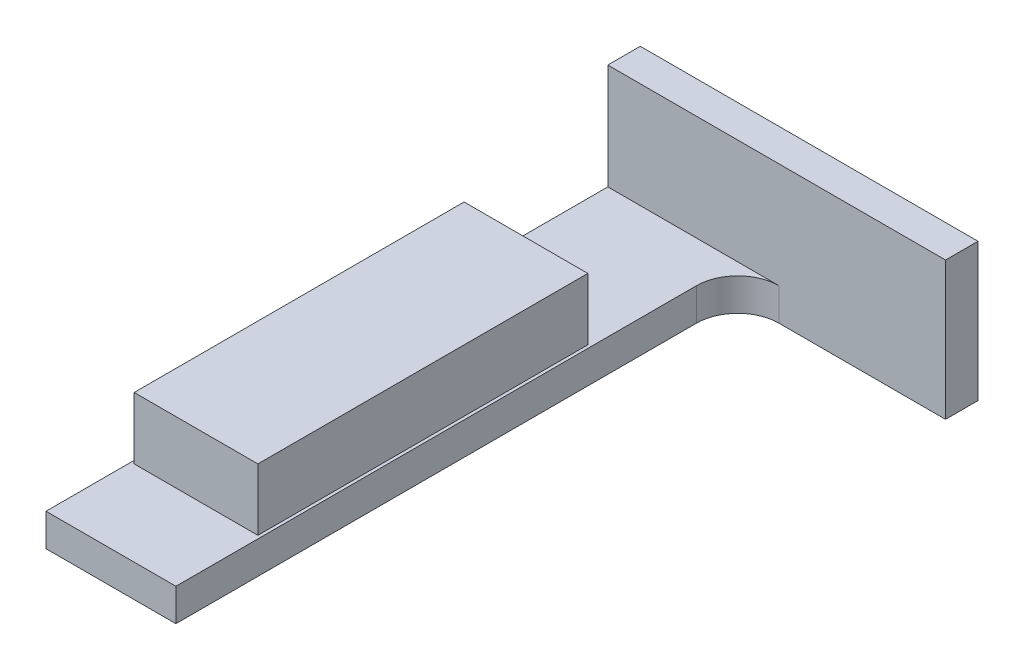
ISO-10303-21;
HEADER;
FILE_DESCRIPTION(('STEP AP214'),'2;1');
FILE_NAME('part.step','',(''),(''),'','','');
FILE_SCHEMA(('AUTOMOTIVE_DESIGN { 1 0 10303 214 1 1 1 1 }'));
ENDSEC;
DATA;
#1=APPLICATION_CONTEXT('core data for automotive mechanical design processes');
#2=APPLICATION_PROTOCOL_DEFINITION('international standard','automotive_design',2000,#1);
#3=PRODUCT_CONTEXT('',#1,'mechanical');
#4=PRODUCT('Part','Part','',(#3));
#5=PRODUCT_RELATED_PRODUCT_CATEGORY('part','',(#4));
#6=PRODUCT_DEFINITION_FORMATION('','',#4);
#7=PRODUCT_DEFINITION_CONTEXT('part definition',#1,'design');
#8=PRODUCT_DEFINITION('design','',#6,#7);
#9=PRODUCT_DEFINITION_SHAPE('','',#8);
#10=(LENGTH_UNIT() NAMED_UNIT(*) SI_UNIT(.MILLI.,.METRE.));
#11=(NAMED_UNIT(*) PLANE_ANGLE_UNIT() SI_UNIT($,.RADIAN.));
#12=(NAMED_UNIT(*) SI_UNIT($,.STERADIAN.) SOLID_ANGLE_UNIT());
#13=UNCERTAINTY_MEASURE_WITH_UNIT(LENGTH_MEASURE(1.E-05),#10,'distance_accuracy_value','');
#14=(GEOMETRIC_REPRESENTATION_CONTEXT(3) GLOBAL_UNCERTAINTY_ASSIGNED_CONTEXT((#13)) GLOBAL_UNIT_ASSIGNED_CONTEXT((#10,
#11,#12)) REPRESENTATION_CONTEXT('',''));
#15=CARTESIAN_POINT('',(0.,0.,0.));
#16=DIRECTION('',(0.,0.,1.));
#17=DIRECTION('',(1.,0.,0.));
#18=AXIS2_PLACEMENT_3D('',#15,#16,#17);
#19=CARTESIAN_POINT('',(0.,-16.25,91.5));
#20=DIRECTION('',(0.,-1.,0.));
#21=DIRECTION('',(0.,0.,-1.));
#22=AXIS2_PLACEMENT_3D('',#19,#20,#21);
#23=PLANE('',#22);
#24=DIRECTION('',(-1.,0.,0.));
#25=VECTOR('',#24,1.);
#26=CARTESIAN_POINT('',(0.,-16.25,5.));
#27=LINE('',#26,#25);
#28=CARTESIAN_POINT('',(26.35,-16.25,5.));
#29=VERTEX_POINT('',#28);
#30=CARTESIAN_POINT('',(0.,-16.25,5.));
#31=VERTEX_POINT('',#30);
#32=EDGE_CURVE('E143',#29,#31,#27,.T.);
#33=ORIENTED_EDGE('',*,*,#32,.T.);
#34=DIRECTION('',(0.,0.,-1.));
#35=VECTOR('',#34,1.);
#36=CARTESIAN_POINT('',(0.,-16.25,91.5));
#37=LINE('',#36,#35);
#38=CARTESIAN_POINT('',(0.,-16.25,91.5));
#39=VERTEX_POINT('',#38);
#40=EDGE_CURVE('E160',#39,#31,#37,.T.);
#41=ORIENTED_EDGE('',*,*,#40,.F.);
#42=DIRECTION('',(-1.,0.,0.));
#43=VECTOR('',#42,1.);
#44=CARTESIAN_POINT('',(0.,-16.25,91.5));
#45=LINE('',#44,#43);
#46=CARTESIAN_POINT('',(20.,-16.25,91.5));
#47=VERTEX_POINT('',#46);
#48=EDGE_CURVE('E158',#47,#39,#45,.T.);
#49=ORIENTED_EDGE('',*,*,#48,.F.);
#50=DIRECTION('',(0.,0.,-1.));
#51=VECTOR('',#50,1.);
#52=CARTESIAN_POINT('',(20.,-16.25,91.5));
#53=LINE('',#52,#51);
#54=CARTESIAN_POINT('',(20.,-16.25,11.35));
#55=VERTEX_POINT('',#54);
#56=EDGE_CURVE('E163',#47,#55,#53,.T.);
#57=ORIENTED_EDGE('',*,*,#56,.T.);
#58=CARTESIAN_POINT('',(26.35,-16.25,11.35));
#59=DIRECTION('',(0.,-1.,0.));
#60=DIRECTION('',(0.,0.,-1.));
#61=AXIS2_PLACEMENT_3D('',#58,#59,#60);
#62=CIRCLE('',#61,6.35);
#63=EDGE_CURVE('E42',#55,#29,#62,.T.);
#64=ORIENTED_EDGE('',*,*,#63,.T.);
#65=EDGE_LOOP('',(#33,#41,#49,#57,#64));
#66=FACE_BOUND('',#65,.T.);
#67=DIRECTION('',(0.,0.,1.));
#68=VECTOR('',#67,1.);
#69=CARTESIAN_POINT('',(0.474999999999993,-16.25,27.6));
#70=LINE('',#69,#68);
#71=CARTESIAN_POINT('',(0.474999999999993,-16.25,27.6));
#72=VERTEX_POINT('',#71);
#73=CARTESIAN_POINT('',(0.475,-16.25,78.4));
#74=VERTEX_POINT('',#73);
#75=EDGE_CURVE('E142',#72,#74,#70,.T.);
#76=ORIENTED_EDGE('',*,*,#75,.F.);
#77=DIRECTION('',(-1.,0.,0.));
#78=VECTOR('',#77,1.);
#79=CARTESIAN_POINT('',(0.474999999999993,-16.25,27.6));
#80=LINE('',#79,#78);
#81=CARTESIAN_POINT('',(19.525,-16.25,27.6));
#82=VERTEX_POINT('',#81);
#83=EDGE_CURVE('E139',#82,#72,#80,.T.);
#84=ORIENTED_EDGE('',*,*,#83,.F.);
#85=DIRECTION('',(0.,0.,-1.));
#86=VECTOR('',#85,1.);
#87=CARTESIAN_POINT('',(19.525,-16.25,27.6));
#88=LINE('',#87,#86);
#89=CARTESIAN_POINT('',(19.525,-16.25,78.4));
#90=VERTEX_POINT('',#89);
#91=EDGE_CURVE('E54',#90,#82,#88,.T.);
#92=ORIENTED_EDGE('',*,*,#91,.F.);
#93=DIRECTION('',(1.,0.,0.));
#94=VECTOR('',#93,1.);
#95=CARTESIAN_POINT('',(0.475,-16.25,78.4));
#96=LINE('',#95,#94);
#97=EDGE_CURVE('E49',#74,#90,#96,.T.);
#98=ORIENTED_EDGE('',*,*,#97,.F.);
#99=EDGE_LOOP('',(#76,#84,#92,#98));
#100=FACE_BOUND('',#99,.T.);
#101=ADVANCED_FACE('F34',(#66,#100),#23,.F.);
#102=CARTESIAN_POINT('',(0.,0.,5.));
#103=DIRECTION('',(1.,0.,0.));
#104=DIRECTION('',(0.,1.,0.));
#105=AXIS2_PLACEMENT_3D('',#102,#103,#104);
#106=PLANE('',#105);
#107=DIRECTION('',(0.,-1.,0.));
#108=VECTOR('',#107,1.);
#109=CARTESIAN_POINT('',(0.,0.,0.));
#110=LINE('',#109,#108);
#111=CARTESIAN_POINT('',(0.,0.,0.));
#112=VERTEX_POINT('',#111);
#113=CARTESIAN_POINT('',(0.,-21.25,0.));
#114=VERTEX_POINT('',#113);
#115=EDGE_CURVE('E190',#112,#114,#110,.T.);
#116=ORIENTED_EDGE('',*,*,#115,.T.);
#117=DIRECTION('',(0.,0.,-1.));
#118=VECTOR('',#117,1.);
#119=CARTESIAN_POINT('',(0.,-21.25,5.));
#120=LINE('',#119,#118);
#121=CARTESIAN_POINT('',(0.,-21.25,91.5));
#122=VERTEX_POINT('',#121);
#123=EDGE_CURVE('E177',#122,#114,#120,.T.);
#124=ORIENTED_EDGE('',*,*,#123,.F.);
#125=DIRECTION('',(0.,-1.,0.));
#126=VECTOR('',#125,1.);
#127=CARTESIAN_POINT('',(0.,-21.25,91.5));
#128=LINE('',#127,#126);
#129=EDGE_CURVE('E146',#39,#122,#128,.T.);
#130=ORIENTED_EDGE('',*,*,#129,.F.);
#131=ORIENTED_EDGE('',*,*,#40,.T.);
#132=DIRECTION('',(0.,-1.,0.));
#133=VECTOR('',#132,1.);
#134=CARTESIAN_POINT('',(0.,0.,5.));
#135=LINE('',#134,#133);
#136=CARTESIAN_POINT('',(0.,0.,5.));
#137=VERTEX_POINT('',#136);
#138=EDGE_CURVE('E182',#137,#31,#135,.T.);
#139=ORIENTED_EDGE('',*,*,#138,.F.);
#140=DIRECTION('',(0.,0.,-1.));
#141=VECTOR('',#140,1.);
#142=CARTESIAN_POINT('',(0.,0.,5.));
#143=LINE('',#142,#141);
#144=EDGE_CURVE('E189',#137,#112,#143,.T.);
#145=ORIENTED_EDGE('',*,*,#144,.T.);
#146=EDGE_LOOP('',(#116,#124,#130,#131,#139,#145));
#147=FACE_BOUND('',#146,.T.);
#148=ADVANCED_FACE('F244',(#147),#106,.F.);
#149=CARTESIAN_POINT('',(0.,-21.25,5.));
#150=DIRECTION('',(0.,1.,0.));
#151=DIRECTION('',(0.,0.,1.));
#152=AXIS2_PLACEMENT_3D('',#149,#150,#151);
#153=PLANE('',#152);
#154=DIRECTION('',(1.,0.,0.));
#155=VECTOR('',#154,1.);
#156=CARTESIAN_POINT('',(0.,-21.25,0.));
#157=LINE('',#156,#155);
#158=CARTESIAN_POINT('',(52.,-21.25,0.));
#159=VERTEX_POINT('',#158);
#160=EDGE_CURVE('E193',#114,#159,#157,.T.);
#161=ORIENTED_EDGE('',*,*,#160,.T.);
#162=DIRECTION('',(0.,0.,-1.));
#163=VECTOR('',#162,1.);
#164=CARTESIAN_POINT('',(52.,-21.25,5.));
#165=LINE('',#164,#163);
#166=CARTESIAN_POINT('',(52.,-21.25,5.));
#167=VERTEX_POINT('',#166);
#168=EDGE_CURVE('E205',#167,#159,#165,.T.);
#169=ORIENTED_EDGE('',*,*,#168,.F.);
#170=DIRECTION('',(1.,0.,0.));
#171=VECTOR('',#170,1.);
#172=CARTESIAN_POINT('',(0.,-21.25,5.));
#173=LINE('',#172,#171);
#174=CARTESIAN_POINT('',(26.35,-21.25,5.));
#175=VERTEX_POINT('',#174);
#176=EDGE_CURVE('E178',#175,#167,#173,.T.);
#177=ORIENTED_EDGE('',*,*,#176,.F.);
#178=CARTESIAN_POINT('',(26.35,-21.25,11.35));
#179=DIRECTION('',(0.,1.,0.));
#180=DIRECTION('',(0.,0.,1.));
#181=AXIS2_PLACEMENT_3D('',#178,#179,#180);
#182=CIRCLE('',#181,6.35);
#183=CARTESIAN_POINT('',(20.,-21.25,11.35));
#184=VERTEX_POINT('',#183);
#185=EDGE_CURVE('E11',#175,#184,#182,.T.);
#186=ORIENTED_EDGE('',*,*,#185,.T.);
#187=DIRECTION('',(0.,0.,-1.));
#188=VECTOR('',#187,1.);
#189=CARTESIAN_POINT('',(20.,-21.25,91.5));
#190=LINE('',#189,#188);
#191=CARTESIAN_POINT('',(20.,-21.25,91.5));
#192=VERTEX_POINT('',#191);
#193=EDGE_CURVE('E194',#192,#184,#190,.T.);
#194=ORIENTED_EDGE('',*,*,#193,.F.);
#195=DIRECTION('',(1.,0.,0.));
#196=VECTOR('',#195,1.);
#197=CARTESIAN_POINT('',(0.,-21.25,91.5));
#198=LINE('',#197,#196);
#199=EDGE_CURVE('E154',#122,#192,#198,.T.);
#200=ORIENTED_EDGE('',*,*,#199,.F.);
#201=ORIENTED_EDGE('',*,*,#123,.T.);
#202=EDGE_LOOP('',(#161,#169,#177,#186,#194,#200,#201));
#203=FACE_BOUND('',#202,.T.);
#204=ADVANCED_FACE('F230',(#203),#153,.F.);
#205=CARTESIAN_POINT('',(52.,0.,5.));
#206=DIRECTION('',(-1.,0.,0.));
#207=DIRECTION('',(0.,0.,1.));
#208=AXIS2_PLACEMENT_3D('',#205,#206,#207);
#209=PLANE('',#208);
#210=DIRECTION('',(0.,1.,0.));
#211=VECTOR('',#210,1.);
#212=CARTESIAN_POINT('',(52.,0.,0.));
#213=LINE('',#212,#211);
#214=CARTESIAN_POINT('',(52.,0.,0.));
#215=VERTEX_POINT('',#214);
#216=EDGE_CURVE('E196',#159,#215,#213,.T.);
#217=ORIENTED_EDGE('',*,*,#216,.T.);
#218=DIRECTION('',(0.,0.,-1.));
#219=VECTOR('',#218,1.);
#220=CARTESIAN_POINT('',(52.,0.,5.));
#221=LINE('',#220,#219);
#222=CARTESIAN_POINT('',(52.,0.,5.));
#223=VERTEX_POINT('',#222);
#224=EDGE_CURVE('E202',#223,#215,#221,.T.);
#225=ORIENTED_EDGE('',*,*,#224,.F.);
#226=DIRECTION('',(0.,1.,0.));
#227=VECTOR('',#226,1.);
#228=CARTESIAN_POINT('',(52.,0.,5.));
#229=LINE('',#228,#227);
#230=EDGE_CURVE('E181',#167,#223,#229,.T.);
#231=ORIENTED_EDGE('',*,*,#230,.F.);
#232=ORIENTED_EDGE('',*,*,#168,.T.);
#233=EDGE_LOOP('',(#217,#225,#231,#232));
#234=FACE_BOUND('',#233,.T.);
#235=ADVANCED_FACE('F235',(#234),#209,.F.);
#236=CARTESIAN_POINT('',(0.,0.,5.));
#237=DIRECTION('',(0.,-1.,0.));
#238=DIRECTION('',(0.,0.,-1.));
#239=AXIS2_PLACEMENT_3D('',#236,#237,#238);
#240=PLANE('',#239);
#241=DIRECTION('',(-1.,0.,0.));
#242=VECTOR('',#241,1.);
#243=CARTESIAN_POINT('',(0.,0.,0.));
#244=LINE('',#243,#242);
#245=EDGE_CURVE('E198',#215,#112,#244,.T.);
#246=ORIENTED_EDGE('',*,*,#245,.T.);
#247=ORIENTED_EDGE('',*,*,#144,.F.);
#248=DIRECTION('',(-1.,0.,0.));
#249=VECTOR('',#248,1.);
#250=CARTESIAN_POINT('',(0.,0.,5.));
#251=LINE('',#250,#249);
#252=EDGE_CURVE('E187',#223,#137,#251,.T.);
#253=ORIENTED_EDGE('',*,*,#252,.F.);
#254=ORIENTED_EDGE('',*,*,#224,.T.);
#255=EDGE_LOOP('',(#246,#247,#253,#254));
#256=FACE_BOUND('',#255,.T.);
#257=ADVANCED_FACE('F240',(#256),#240,.F.);
#258=CARTESIAN_POINT('',(0.,-21.25,5.));
#259=DIRECTION('',(0.,0.,1.));
#260=DIRECTION('',(1.,0.,0.));
#261=AXIS2_PLACEMENT_3D('',#258,#259,#260);
#262=PLANE('',#261);
#263=ORIENTED_EDGE('',*,*,#32,.F.);
#264=DIRECTION('',(0.,1.,0.));
#265=VECTOR('',#264,1.);
#266=CARTESIAN_POINT('',(26.35,-21.25,5.));
#267=LINE('',#266,#265);
#268=EDGE_CURVE('E176',#29,#175,#267,.F.);
#269=ORIENTED_EDGE('',*,*,#268,.T.);
#270=ORIENTED_EDGE('',*,*,#176,.T.);
#271=ORIENTED_EDGE('',*,*,#230,.T.);
#272=ORIENTED_EDGE('',*,*,#252,.T.);
#273=ORIENTED_EDGE('',*,*,#138,.T.);
#274=EDGE_LOOP('',(#263,#269,#270,#271,#272,#273));
#275=FACE_BOUND('',#274,.T.);
#276=ADVANCED_FACE('F227',(#275),#262,.T.);
#277=CARTESIAN_POINT('',(0.,-21.25,0.));
#278=DIRECTION('',(0.,0.,1.));
#279=DIRECTION('',(1.,0.,0.));
#280=AXIS2_PLACEMENT_3D('',#277,#278,#279);
#281=PLANE('',#280);
#282=ORIENTED_EDGE('',*,*,#115,.F.);
#283=ORIENTED_EDGE('',*,*,#245,.F.);
#284=ORIENTED_EDGE('',*,*,#216,.F.);
#285=ORIENTED_EDGE('',*,*,#160,.F.);
#286=EDGE_LOOP('',(#282,#283,#284,#285));
#287=FACE_BOUND('',#286,.T.);
#288=ADVANCED_FACE('F250',(#287),#281,.F.);
#289=CARTESIAN_POINT('',(20.,-21.25,91.5));
#290=DIRECTION('',(-1.,0.,0.));
#291=DIRECTION('',(0.,0.,1.));
#292=AXIS2_PLACEMENT_3D('',#289,#290,#291);
#293=PLANE('',#292);
#294=ORIENTED_EDGE('',*,*,#193,.T.);
#295=DIRECTION('',(0.,1.,0.));
#296=VECTOR('',#295,1.);
#297=CARTESIAN_POINT('',(20.,-21.25,11.35));
#298=LINE('',#297,#296);
#299=EDGE_CURVE('E173',#184,#55,#298,.T.);
#300=ORIENTED_EDGE('',*,*,#299,.T.);
#301=ORIENTED_EDGE('',*,*,#56,.F.);
#302=DIRECTION('',(0.,1.,0.));
#303=VECTOR('',#302,1.);
#304=CARTESIAN_POINT('',(20.,-21.25,91.5));
#305=LINE('',#304,#303);
#306=EDGE_CURVE('E156',#192,#47,#305,.T.);
#307=ORIENTED_EDGE('',*,*,#306,.F.);
#308=EDGE_LOOP('',(#294,#300,#301,#307));
#309=FACE_BOUND('',#308,.T.);
#310=ADVANCED_FACE('F222',(#309),#293,.F.);
#311=CARTESIAN_POINT('',(0.,-16.25,91.5));
#312=DIRECTION('',(0.,0.,-1.));
#313=DIRECTION('',(-1.,0.,0.));
#314=AXIS2_PLACEMENT_3D('',#311,#312,#313);
#315=PLANE('',#314);
#316=ORIENTED_EDGE('',*,*,#129,.T.);
#317=ORIENTED_EDGE('',*,*,#199,.T.);
#318=ORIENTED_EDGE('',*,*,#306,.T.);
#319=ORIENTED_EDGE('',*,*,#48,.T.);
#320=EDGE_LOOP('',(#316,#317,#318,#319));
#321=FACE_BOUND('',#320,.T.);
#322=ADVANCED_FACE('F248',(#321),#315,.F.);
#323=CARTESIAN_POINT('',(26.35,-21.25,11.35));
#324=DIRECTION('',(0.,1.,0.));
#325=DIRECTION('',(0.,0.,1.));
#326=AXIS2_PLACEMENT_3D('',#323,#324,#325);
#327=CYLINDRICAL_SURFACE('',#326,6.35);
#328=ORIENTED_EDGE('',*,*,#185,.F.);
#329=ORIENTED_EDGE('',*,*,#268,.F.);
#330=ORIENTED_EDGE('',*,*,#63,.F.);
#331=ORIENTED_EDGE('',*,*,#299,.F.);
#332=EDGE_LOOP('',(#328,#329,#330,#331));
#333=FACE_BOUND('',#332,.T.);
#334=ADVANCED_FACE('F36',(#333),#327,.F.);
#335=CARTESIAN_POINT('',(0.474999999999993,-6.725,27.6));
#336=DIRECTION('',(1.,0.,0.));
#337=DIRECTION('',(0.,0.,-1.));
#338=AXIS2_PLACEMENT_3D('',#335,#336,#337);
#339=PLANE('',#338);
#340=ORIENTED_EDGE('',*,*,#75,.T.);
#341=DIRECTION('',(0.,-1.,0.));
#342=VECTOR('',#341,1.);
#343=CARTESIAN_POINT('',(0.475,-6.725,78.4));
#344=LINE('',#343,#342);
#345=CARTESIAN_POINT('',(0.475,-6.725,78.4));
#346=VERTEX_POINT('',#345);
#347=EDGE_CURVE('E123',#346,#74,#344,.T.);
#348=ORIENTED_EDGE('',*,*,#347,.F.);
#349=DIRECTION('',(0.,0.,1.));
#350=VECTOR('',#349,1.);
#351=CARTESIAN_POINT('',(0.474999999999993,-6.725,27.6));
#352=LINE('',#351,#350);
#353=CARTESIAN_POINT('',(0.474999999999993,-6.725,27.6));
#354=VERTEX_POINT('',#353);
#355=EDGE_CURVE('E130',#354,#346,#352,.T.);
#356=ORIENTED_EDGE('',*,*,#355,.F.);
#357=DIRECTION('',(0.,-1.,0.));
#358=VECTOR('',#357,1.);
#359=CARTESIAN_POINT('',(0.474999999999993,-6.725,27.6));
#360=LINE('',#359,#358);
#361=EDGE_CURVE('E381',#354,#72,#360,.T.);
#362=ORIENTED_EDGE('',*,*,#361,.T.);
#363=EDGE_LOOP('',(#340,#348,#356,#362));
#364=FACE_BOUND('',#363,.T.);
#365=ADVANCED_FACE('F141',(#364),#339,.F.);
#366=CARTESIAN_POINT('',(0.475,-6.725,78.4));
#367=DIRECTION('',(0.,0.,-1.));
#368=DIRECTION('',(-1.,0.,0.));
#369=AXIS2_PLACEMENT_3D('',#366,#367,#368);
#370=PLANE('',#369);
#371=ORIENTED_EDGE('',*,*,#97,.T.);
#372=DIRECTION('',(0.,-1.,0.));
#373=VECTOR('',#372,1.);
#374=CARTESIAN_POINT('',(19.525,-6.725,78.4));
#375=LINE('',#374,#373);
#376=CARTESIAN_POINT('',(19.525,-6.725,78.4));
#377=VERTEX_POINT('',#376);
#378=EDGE_CURVE('E126',#377,#90,#375,.T.);
#379=ORIENTED_EDGE('',*,*,#378,.F.);
#380=DIRECTION('',(1.,0.,0.));
#381=VECTOR('',#380,1.);
#382=CARTESIAN_POINT('',(0.475,-6.725,78.4));
#383=LINE('',#382,#381);
#384=EDGE_CURVE('E119',#346,#377,#383,.T.);
#385=ORIENTED_EDGE('',*,*,#384,.F.);
#386=ORIENTED_EDGE('',*,*,#347,.T.);
#387=EDGE_LOOP('',(#371,#379,#385,#386));
#388=FACE_BOUND('',#387,.T.);
#389=ADVANCED_FACE('F121',(#388),#370,.F.);
#390=CARTESIAN_POINT('',(19.525,-6.725,27.6));
#391=DIRECTION('',(-1.,0.,0.));
#392=DIRECTION('',(0.,0.,1.));
#393=AXIS2_PLACEMENT_3D('',#390,#391,#392);
#394=PLANE('',#393);
#395=ORIENTED_EDGE('',*,*,#91,.T.);
#396=DIRECTION('',(0.,-1.,0.));
#397=VECTOR('',#396,1.);
#398=CARTESIAN_POINT('',(19.525,-6.725,27.6));
#399=LINE('',#398,#397);
#400=CARTESIAN_POINT('',(19.525,-6.725,27.6));
#401=VERTEX_POINT('',#400);
#402=EDGE_CURVE('E148',#401,#82,#399,.T.);
#403=ORIENTED_EDGE('',*,*,#402,.F.);
#404=DIRECTION('',(0.,0.,-1.));
#405=VECTOR('',#404,1.);
#406=CARTESIAN_POINT('',(19.525,-6.725,27.6));
#407=LINE('',#406,#405);
#408=EDGE_CURVE('E129',#377,#401,#407,.T.);
#409=ORIENTED_EDGE('',*,*,#408,.F.);
#410=ORIENTED_EDGE('',*,*,#378,.T.);
#411=EDGE_LOOP('',(#395,#403,#409,#410));
#412=FACE_BOUND('',#411,.T.);
#413=ADVANCED_FACE('F272',(#412),#394,.F.);
#414=CARTESIAN_POINT('',(0.474999999999993,-6.725,27.6));
#415=DIRECTION('',(0.,0.,1.));
#416=DIRECTION('',(1.,0.,0.));
#417=AXIS2_PLACEMENT_3D('',#414,#415,#416);
#418=PLANE('',#417);
#419=ORIENTED_EDGE('',*,*,#83,.T.);
#420=ORIENTED_EDGE('',*,*,#361,.F.);
#421=DIRECTION('',(-1.,0.,0.));
#422=VECTOR('',#421,1.);
#423=CARTESIAN_POINT('',(0.474999999999993,-6.725,27.6));
#424=LINE('',#423,#422);
#425=EDGE_CURVE('E135',#401,#354,#424,.T.);
#426=ORIENTED_EDGE('',*,*,#425,.F.);
#427=ORIENTED_EDGE('',*,*,#402,.T.);
#428=EDGE_LOOP('',(#419,#420,#426,#427));
#429=FACE_BOUND('',#428,.T.);
#430=ADVANCED_FACE('F275',(#429),#418,.F.);
#431=CARTESIAN_POINT('',(0.475,-6.725,78.4));
#432=DIRECTION('',(0.,1.,0.));
#433=DIRECTION('',(0.,0.,1.));
#434=AXIS2_PLACEMENT_3D('',#431,#432,#433);
#435=PLANE('',#434);
#436=ORIENTED_EDGE('',*,*,#355,.T.);
#437=ORIENTED_EDGE('',*,*,#384,.T.);
#438=ORIENTED_EDGE('',*,*,#408,.T.);
#439=ORIENTED_EDGE('',*,*,#425,.T.);
#440=EDGE_LOOP('',(#436,#437,#438,#439));
#441=FACE_BOUND('',#440,.T.);
#442=ADVANCED_FACE('F133',(#441),#435,.T.);
#443=CLOSED_SHELL('',(#101,#148,#204,#235,#257,#276,#288,#310,#322,#334,#365,#389,#413,#430,#442));
#444=MANIFOLD_SOLID_BREP('B2',#443);
#445=ADVANCED_BREP_SHAPE_REPRESENTATION('',(#18,#444),#14);
#446=SHAPE_DEFINITION_REPRESENTATION(#9,#445);
ENDSEC;
END-ISO-10303-21;
